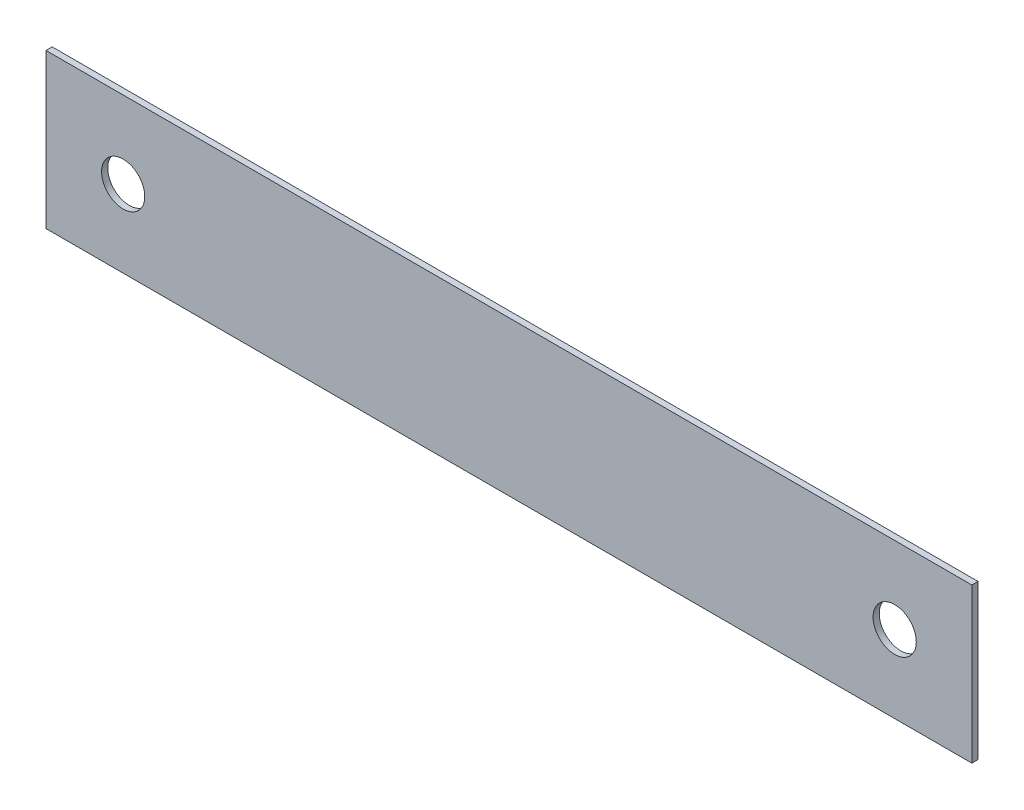
ISO-10303-21;
HEADER;
FILE_DESCRIPTION(('STEP AP214'),'2;1');
FILE_NAME('part.step','',(''),(''),'','','');
FILE_SCHEMA(('AUTOMOTIVE_DESIGN { 1 0 10303 214 1 1 1 1 }'));
ENDSEC;
DATA;
#1=APPLICATION_CONTEXT('core data for automotive mechanical design processes');
#2=APPLICATION_PROTOCOL_DEFINITION('international standard','automotive_design',2000,#1);
#3=PRODUCT_CONTEXT('',#1,'mechanical');
#4=PRODUCT('Part','Part','',(#3));
#5=PRODUCT_RELATED_PRODUCT_CATEGORY('part','',(#4));
#6=PRODUCT_DEFINITION_FORMATION('','',#4);
#7=PRODUCT_DEFINITION_CONTEXT('part definition',#1,'design');
#8=PRODUCT_DEFINITION('design','',#6,#7);
#9=PRODUCT_DEFINITION_SHAPE('','',#8);
#10=(LENGTH_UNIT() NAMED_UNIT(*) SI_UNIT(.MILLI.,.METRE.));
#11=(NAMED_UNIT(*) PLANE_ANGLE_UNIT() SI_UNIT($,.RADIAN.));
#12=(NAMED_UNIT(*) SI_UNIT($,.STERADIAN.) SOLID_ANGLE_UNIT());
#13=UNCERTAINTY_MEASURE_WITH_UNIT(LENGTH_MEASURE(1.E-05),#10,'distance_accuracy_value','');
#14=(GEOMETRIC_REPRESENTATION_CONTEXT(3) GLOBAL_UNCERTAINTY_ASSIGNED_CONTEXT((#13)) GLOBAL_UNIT_ASSIGNED_CONTEXT((#10,
#11,#12)) REPRESENTATION_CONTEXT('',''));
#15=CARTESIAN_POINT('',(0.,0.,0.));
#16=DIRECTION('',(0.,0.,1.));
#17=DIRECTION('',(1.,0.,0.));
#18=AXIS2_PLACEMENT_3D('',#15,#16,#17);
#19=CARTESIAN_POINT('',(0.,0.,1.));
#20=DIRECTION('',(0.,0.,1.));
#21=DIRECTION('',(1.,0.,0.));
#22=AXIS2_PLACEMENT_3D('',#19,#20,#21);
#23=PLANE('',#22);
#24=CARTESIAN_POINT('',(12.5,12.5,1.));
#25=DIRECTION('',(0.,0.,1.));
#26=DIRECTION('',(1.,0.,0.));
#27=AXIS2_PLACEMENT_3D('',#24,#25,#26);
#28=CIRCLE('',#27,3.5);
#29=CARTESIAN_POINT('',(16.,12.5,1.));
#30=VERTEX_POINT('',#29);
#31=EDGE_CURVE('E112',#30,#30,#28,.T.);
#32=ORIENTED_EDGE('',*,*,#31,.F.);
#33=EDGE_LOOP('',(#32));
#34=FACE_BOUND('',#33,.T.);
#35=DIRECTION('',(0.,-1.,0.));
#36=VECTOR('',#35,1.);
#37=CARTESIAN_POINT('',(0.,25.,1.));
#38=LINE('',#37,#36);
#39=CARTESIAN_POINT('',(0.,25.,1.));
#40=VERTEX_POINT('',#39);
#41=CARTESIAN_POINT('',(0.,0.,1.));
#42=VERTEX_POINT('',#41);
#43=EDGE_CURVE('E92',#40,#42,#38,.T.);
#44=ORIENTED_EDGE('',*,*,#43,.T.);
#45=DIRECTION('',(1.,0.,0.));
#46=VECTOR('',#45,1.);
#47=CARTESIAN_POINT('',(0.,0.,1.));
#48=LINE('',#47,#46);
#49=CARTESIAN_POINT('',(150.,0.,1.));
#50=VERTEX_POINT('',#49);
#51=EDGE_CURVE('E87',#42,#50,#48,.T.);
#52=ORIENTED_EDGE('',*,*,#51,.T.);
#53=DIRECTION('',(0.,1.,0.));
#54=VECTOR('',#53,1.);
#55=CARTESIAN_POINT('',(150.,0.,1.));
#56=LINE('',#55,#54);
#57=CARTESIAN_POINT('',(150.,25.,1.));
#58=VERTEX_POINT('',#57);
#59=EDGE_CURVE('E90',#50,#58,#56,.T.);
#60=ORIENTED_EDGE('',*,*,#59,.T.);
#61=DIRECTION('',(-1.,0.,0.));
#62=VECTOR('',#61,1.);
#63=CARTESIAN_POINT('',(150.,25.,1.));
#64=LINE('',#63,#62);
#65=EDGE_CURVE('E57',#58,#40,#64,.T.);
#66=ORIENTED_EDGE('',*,*,#65,.T.);
#67=EDGE_LOOP('',(#44,#52,#60,#66));
#68=FACE_BOUND('',#67,.T.);
#69=CARTESIAN_POINT('',(137.5,12.5,1.));
#70=DIRECTION('',(0.,0.,1.));
#71=DIRECTION('',(1.,0.,0.));
#72=AXIS2_PLACEMENT_3D('',#69,#70,#71);
#73=CIRCLE('',#72,3.49999999999999);
#74=CARTESIAN_POINT('',(141.,12.5,1.));
#75=VERTEX_POINT('',#74);
#76=EDGE_CURVE('E134',#75,#75,#73,.T.);
#77=ORIENTED_EDGE('',*,*,#76,.F.);
#78=EDGE_LOOP('',(#77));
#79=FACE_BOUND('',#78,.T.);
#80=ADVANCED_FACE('F39',(#34,#68,#79),#23,.T.);
#81=CARTESIAN_POINT('',(0.,0.,0.));
#82=DIRECTION('',(0.,0.,1.));
#83=DIRECTION('',(1.,0.,0.));
#84=AXIS2_PLACEMENT_3D('',#81,#82,#83);
#85=PLANE('',#84);
#86=DIRECTION('',(0.,-1.,0.));
#87=VECTOR('',#86,1.);
#88=CARTESIAN_POINT('',(0.,25.,0.));
#89=LINE('',#88,#87);
#90=CARTESIAN_POINT('',(0.,25.,0.));
#91=VERTEX_POINT('',#90);
#92=CARTESIAN_POINT('',(0.,0.,0.));
#93=VERTEX_POINT('',#92);
#94=EDGE_CURVE('E108',#91,#93,#89,.T.);
#95=ORIENTED_EDGE('',*,*,#94,.F.);
#96=DIRECTION('',(-1.,0.,0.));
#97=VECTOR('',#96,1.);
#98=CARTESIAN_POINT('',(150.,25.,0.));
#99=LINE('',#98,#97);
#100=CARTESIAN_POINT('',(150.,25.,0.));
#101=VERTEX_POINT('',#100);
#102=EDGE_CURVE('E80',#101,#91,#99,.T.);
#103=ORIENTED_EDGE('',*,*,#102,.F.);
#104=DIRECTION('',(0.,1.,0.));
#105=VECTOR('',#104,1.);
#106=CARTESIAN_POINT('',(150.,0.,0.));
#107=LINE('',#106,#105);
#108=CARTESIAN_POINT('',(150.,0.,0.));
#109=VERTEX_POINT('',#108);
#110=EDGE_CURVE('E74',#109,#101,#107,.T.);
#111=ORIENTED_EDGE('',*,*,#110,.F.);
#112=DIRECTION('',(1.,0.,0.));
#113=VECTOR('',#112,1.);
#114=CARTESIAN_POINT('',(0.,0.,0.));
#115=LINE('',#114,#113);
#116=EDGE_CURVE('E97',#93,#109,#115,.T.);
#117=ORIENTED_EDGE('',*,*,#116,.F.);
#118=EDGE_LOOP('',(#95,#103,#111,#117));
#119=FACE_BOUND('',#118,.T.);
#120=CARTESIAN_POINT('',(12.5,12.5,0.));
#121=DIRECTION('',(0.,0.,1.));
#122=DIRECTION('',(1.,0.,0.));
#123=AXIS2_PLACEMENT_3D('',#120,#121,#122);
#124=CIRCLE('',#123,3.5);
#125=CARTESIAN_POINT('',(16.,12.5,0.));
#126=VERTEX_POINT('',#125);
#127=EDGE_CURVE('E130',#126,#126,#124,.T.);
#128=ORIENTED_EDGE('',*,*,#127,.T.);
#129=EDGE_LOOP('',(#128));
#130=FACE_BOUND('',#129,.T.);
#131=CARTESIAN_POINT('',(137.5,12.5,0.));
#132=DIRECTION('',(0.,0.,1.));
#133=DIRECTION('',(1.,0.,0.));
#134=AXIS2_PLACEMENT_3D('',#131,#132,#133);
#135=CIRCLE('',#134,3.49999999999999);
#136=CARTESIAN_POINT('',(141.,12.5,0.));
#137=VERTEX_POINT('',#136);
#138=EDGE_CURVE('E138',#137,#137,#135,.T.);
#139=ORIENTED_EDGE('',*,*,#138,.T.);
#140=EDGE_LOOP('',(#139));
#141=FACE_BOUND('',#140,.T.);
#142=ADVANCED_FACE('F125',(#119,#130,#141),#85,.F.);
#143=CARTESIAN_POINT('',(0.,25.,1.));
#144=DIRECTION('',(1.,0.,0.));
#145=DIRECTION('',(0.,0.,-1.));
#146=AXIS2_PLACEMENT_3D('',#143,#144,#145);
#147=PLANE('',#146);
#148=ORIENTED_EDGE('',*,*,#94,.T.);
#149=DIRECTION('',(0.,0.,-1.));
#150=VECTOR('',#149,1.);
#151=CARTESIAN_POINT('',(0.,0.,1.));
#152=LINE('',#151,#150);
#153=EDGE_CURVE('E11',#42,#93,#152,.T.);
#154=ORIENTED_EDGE('',*,*,#153,.F.);
#155=ORIENTED_EDGE('',*,*,#43,.F.);
#156=DIRECTION('',(0.,0.,-1.));
#157=VECTOR('',#156,1.);
#158=CARTESIAN_POINT('',(0.,25.,1.));
#159=LINE('',#158,#157);
#160=EDGE_CURVE('E104',#40,#91,#159,.T.);
#161=ORIENTED_EDGE('',*,*,#160,.T.);
#162=EDGE_LOOP('',(#148,#154,#155,#161));
#163=FACE_BOUND('',#162,.T.);
#164=ADVANCED_FACE('F41',(#163),#147,.F.);
#165=CARTESIAN_POINT('',(0.,0.,1.));
#166=DIRECTION('',(0.,1.,0.));
#167=DIRECTION('',(0.,0.,1.));
#168=AXIS2_PLACEMENT_3D('',#165,#166,#167);
#169=PLANE('',#168);
#170=ORIENTED_EDGE('',*,*,#116,.T.);
#171=DIRECTION('',(0.,0.,-1.));
#172=VECTOR('',#171,1.);
#173=CARTESIAN_POINT('',(150.,0.,1.));
#174=LINE('',#173,#172);
#175=EDGE_CURVE('E49',#50,#109,#174,.T.);
#176=ORIENTED_EDGE('',*,*,#175,.F.);
#177=ORIENTED_EDGE('',*,*,#51,.F.);
#178=ORIENTED_EDGE('',*,*,#153,.T.);
#179=EDGE_LOOP('',(#170,#176,#177,#178));
#180=FACE_BOUND('',#179,.T.);
#181=ADVANCED_FACE('F96',(#180),#169,.F.);
#182=CARTESIAN_POINT('',(150.,0.,1.));
#183=DIRECTION('',(-1.,0.,0.));
#184=DIRECTION('',(0.,0.,1.));
#185=AXIS2_PLACEMENT_3D('',#182,#183,#184);
#186=PLANE('',#185);
#187=ORIENTED_EDGE('',*,*,#110,.T.);
#188=DIRECTION('',(0.,0.,-1.));
#189=VECTOR('',#188,1.);
#190=CARTESIAN_POINT('',(150.,25.,1.));
#191=LINE('',#190,#189);
#192=EDGE_CURVE('E99',#58,#101,#191,.T.);
#193=ORIENTED_EDGE('',*,*,#192,.F.);
#194=ORIENTED_EDGE('',*,*,#59,.F.);
#195=ORIENTED_EDGE('',*,*,#175,.T.);
#196=EDGE_LOOP('',(#187,#193,#194,#195));
#197=FACE_BOUND('',#196,.T.);
#198=ADVANCED_FACE('F100',(#197),#186,.F.);
#199=CARTESIAN_POINT('',(150.,25.,1.));
#200=DIRECTION('',(0.,-1.,0.));
#201=DIRECTION('',(0.,0.,-1.));
#202=AXIS2_PLACEMENT_3D('',#199,#200,#201);
#203=PLANE('',#202);
#204=ORIENTED_EDGE('',*,*,#102,.T.);
#205=ORIENTED_EDGE('',*,*,#160,.F.);
#206=ORIENTED_EDGE('',*,*,#65,.F.);
#207=ORIENTED_EDGE('',*,*,#192,.T.);
#208=EDGE_LOOP('',(#204,#205,#206,#207));
#209=FACE_BOUND('',#208,.T.);
#210=ADVANCED_FACE('F122',(#209),#203,.F.);
#211=CARTESIAN_POINT('',(12.5,12.5,1.));
#212=DIRECTION('',(0.,0.,-1.));
#213=DIRECTION('',(-1.,0.,0.));
#214=AXIS2_PLACEMENT_3D('',#211,#212,#213);
#215=CYLINDRICAL_SURFACE('',#214,3.5);
#216=ORIENTED_EDGE('',*,*,#31,.T.);
#217=EDGE_LOOP('',(#216));
#218=FACE_BOUND('',#217,.T.);
#219=ORIENTED_EDGE('',*,*,#127,.F.);
#220=EDGE_LOOP('',(#219));
#221=FACE_BOUND('',#220,.T.);
#222=ADVANCED_FACE('F157',(#218,#221),#215,.F.);
#223=CARTESIAN_POINT('',(137.5,12.5,1.));
#224=DIRECTION('',(0.,0.,-1.));
#225=DIRECTION('',(-1.,0.,0.));
#226=AXIS2_PLACEMENT_3D('',#223,#224,#225);
#227=CYLINDRICAL_SURFACE('',#226,3.49999999999999);
#228=ORIENTED_EDGE('',*,*,#76,.T.);
#229=EDGE_LOOP('',(#228));
#230=FACE_BOUND('',#229,.T.);
#231=ORIENTED_EDGE('',*,*,#138,.F.);
#232=EDGE_LOOP('',(#231));
#233=FACE_BOUND('',#232,.T.);
#234=ADVANCED_FACE('F146',(#230,#233),#227,.F.);
#235=CLOSED_SHELL('',(#80,#142,#164,#181,#198,#210,#222,#234));
#236=MANIFOLD_SOLID_BREP('B2',#235);
#237=ADVANCED_BREP_SHAPE_REPRESENTATION('',(#18,#236),#14);
#238=SHAPE_DEFINITION_REPRESENTATION(#9,#237);
ENDSEC;
END-ISO-10303-21;
